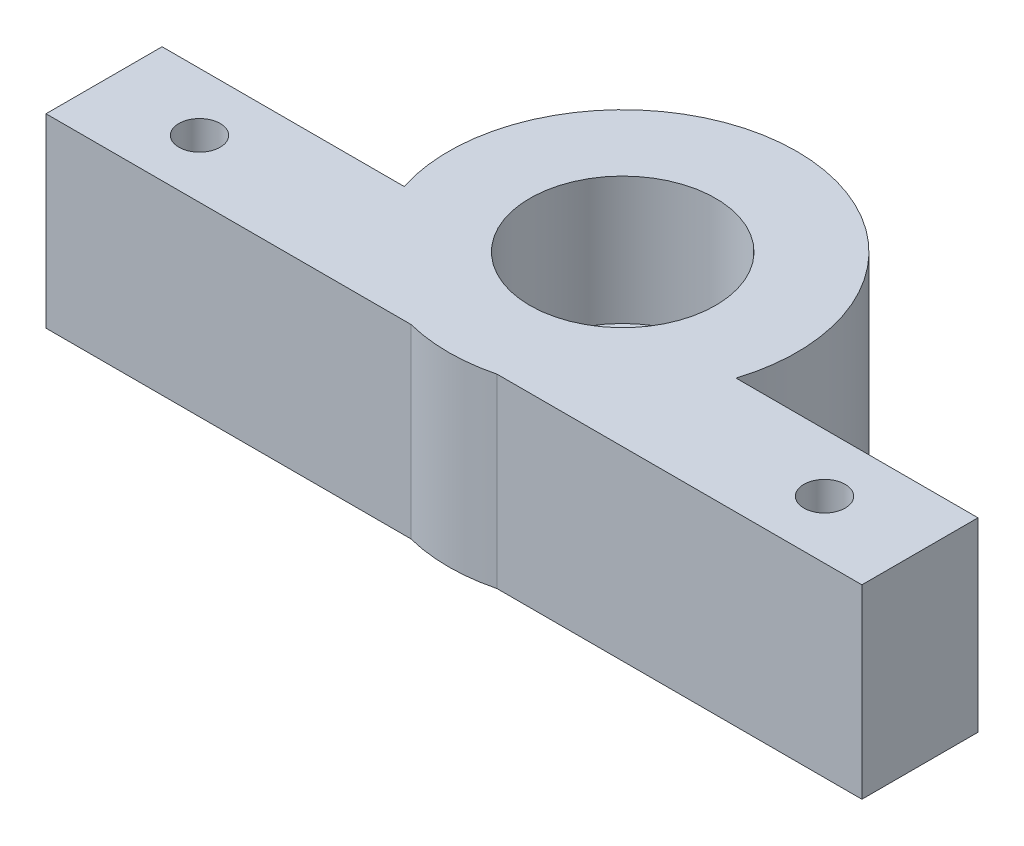
ISO-10303-21;
HEADER;
FILE_DESCRIPTION(('STEP AP214'),'2;1');
FILE_NAME('part.step','',(''),(''),'','','');
FILE_SCHEMA(('AUTOMOTIVE_DESIGN { 1 0 10303 214 1 1 1 1 }'));
ENDSEC;
DATA;
#1=APPLICATION_CONTEXT('core data for automotive mechanical design processes');
#2=APPLICATION_PROTOCOL_DEFINITION('international standard','automotive_design',2000,#1);
#3=PRODUCT_CONTEXT('',#1,'mechanical');
#4=PRODUCT('Part','Part','',(#3));
#5=PRODUCT_RELATED_PRODUCT_CATEGORY('part','',(#4));
#6=PRODUCT_DEFINITION_FORMATION('','',#4);
#7=PRODUCT_DEFINITION_CONTEXT('part definition',#1,'design');
#8=PRODUCT_DEFINITION('design','',#6,#7);
#9=PRODUCT_DEFINITION_SHAPE('','',#8);
#10=(LENGTH_UNIT() NAMED_UNIT(*) SI_UNIT(.MILLI.,.METRE.));
#11=(NAMED_UNIT(*) PLANE_ANGLE_UNIT() SI_UNIT($,.RADIAN.));
#12=(NAMED_UNIT(*) SI_UNIT($,.STERADIAN.) SOLID_ANGLE_UNIT());
#13=UNCERTAINTY_MEASURE_WITH_UNIT(LENGTH_MEASURE(1.E-05),#10,'distance_accuracy_value','');
#14=(GEOMETRIC_REPRESENTATION_CONTEXT(3) GLOBAL_UNCERTAINTY_ASSIGNED_CONTEXT((#13)) GLOBAL_UNIT_ASSIGNED_CONTEXT((#10,
#11,#12)) REPRESENTATION_CONTEXT('',''));
#15=CARTESIAN_POINT('',(0.,0.,0.));
#16=DIRECTION('',(0.,0.,1.));
#17=DIRECTION('',(1.,0.,0.));
#18=AXIS2_PLACEMENT_3D('',#15,#16,#17);
#19=CARTESIAN_POINT('',(0.,8.,0.));
#20=DIRECTION('',(0.,-1.,0.));
#21=DIRECTION('',(0.,0.,-1.));
#22=AXIS2_PLACEMENT_3D('',#19,#20,#21);
#23=CYLINDRICAL_SURFACE('',#22,1.875);
#24=CARTESIAN_POINT('',(0.,0.,0.));
#25=DIRECTION('',(0.,1.,0.));
#26=DIRECTION('',(0.,0.,1.));
#27=AXIS2_PLACEMENT_3D('',#24,#25,#26);
#28=CIRCLE('',#27,1.875);
#29=CARTESIAN_POINT('',(0.,0.,1.875));
#30=VERTEX_POINT('',#29);
#31=EDGE_CURVE('E138',#30,#30,#28,.T.);
#32=ORIENTED_EDGE('',*,*,#31,.F.);
#33=EDGE_LOOP('',(#32));
#34=FACE_BOUND('',#33,.T.);
#35=CARTESIAN_POINT('',(0.,2.5,0.));
#36=DIRECTION('',(0.,1.,0.));
#37=DIRECTION('',(0.,0.,1.));
#38=AXIS2_PLACEMENT_3D('',#35,#36,#37);
#39=CIRCLE('',#38,1.875);
#40=CARTESIAN_POINT('',(0.,2.5,1.875));
#41=VERTEX_POINT('',#40);
#42=EDGE_CURVE('E39',#41,#41,#39,.T.);
#43=ORIENTED_EDGE('',*,*,#42,.T.);
#44=EDGE_LOOP('',(#43));
#45=FACE_BOUND('',#44,.T.);
#46=ADVANCED_FACE('F35',(#34,#45),#23,.F.);
#47=CARTESIAN_POINT('',(0.,8.,0.));
#48=DIRECTION('',(0.,1.,0.));
#49=DIRECTION('',(0.,0.,1.));
#50=AXIS2_PLACEMENT_3D('',#47,#48,#49);
#51=PLANE('',#50);
#52=CARTESIAN_POINT('',(0.,8.,0.));
#53=DIRECTION('',(0.,1.,0.));
#54=DIRECTION('',(0.,0.,1.));
#55=AXIS2_PLACEMENT_3D('',#52,#53,#54);
#56=CIRCLE('',#55,4.);
#57=CARTESIAN_POINT('',(0.,8.,4.));
#58=VERTEX_POINT('',#57);
#59=EDGE_CURVE('E198',#58,#58,#56,.T.);
#60=ORIENTED_EDGE('',*,*,#59,.F.);
#61=EDGE_LOOP('',(#60));
#62=FACE_BOUND('',#61,.T.);
#63=CARTESIAN_POINT('',(-13.46,8.,4.76772943389164));
#64=DIRECTION('',(0.,1.,0.));
#65=DIRECTION('',(0.,0.,1.));
#66=AXIS2_PLACEMENT_3D('',#63,#64,#65);
#67=CIRCLE('',#66,0.889000000000002);
#68=CARTESIAN_POINT('',(-13.46,8.,5.65672943389165));
#69=VERTEX_POINT('',#68);
#70=EDGE_CURVE('E186',#69,#69,#67,.T.);
#71=ORIENTED_EDGE('',*,*,#70,.F.);
#72=EDGE_LOOP('',(#71));
#73=FACE_BOUND('',#72,.T.);
#74=CARTESIAN_POINT('',(0.,8.,0.));
#75=DIRECTION('',(0.,1.,0.));
#76=DIRECTION('',(0.,0.,1.));
#77=AXIS2_PLACEMENT_3D('',#74,#75,#76);
#78=CIRCLE('',#77,7.5);
#79=CARTESIAN_POINT('',(-1.85205531120024,8.,7.26772943389164));
#80=VERTEX_POINT('',#79);
#81=CARTESIAN_POINT('',(1.85205531120024,8.,7.26772943389164));
#82=VERTEX_POINT('',#81);
#83=EDGE_CURVE('E149',#80,#82,#78,.T.);
#84=ORIENTED_EDGE('',*,*,#83,.T.);
#85=DIRECTION('',(1.,0.,0.));
#86=VECTOR('',#85,1.);
#87=CARTESIAN_POINT('',(17.5696170458769,8.,7.26772943389164));
#88=LINE('',#87,#86);
#89=CARTESIAN_POINT('',(17.5696170458769,8.,7.26772943389164));
#90=VERTEX_POINT('',#89);
#91=EDGE_CURVE('E96',#82,#90,#88,.T.);
#92=ORIENTED_EDGE('',*,*,#91,.T.);
#93=DIRECTION('',(0.,0.,-1.));
#94=VECTOR('',#93,1.);
#95=CARTESIAN_POINT('',(17.5696170458769,8.,2.26772943389165));
#96=LINE('',#95,#94);
#97=CARTESIAN_POINT('',(17.5696170458769,8.,2.26772943389165));
#98=VERTEX_POINT('',#97);
#99=EDGE_CURVE('E165',#90,#98,#96,.T.);
#100=ORIENTED_EDGE('',*,*,#99,.T.);
#101=DIRECTION('',(-1.,0.,0.));
#102=VECTOR('',#101,1.);
#103=CARTESIAN_POINT('',(7.14894420279397,8.,2.26772943389165));
#104=LINE('',#103,#102);
#105=CARTESIAN_POINT('',(7.14894420279397,8.,2.26772943389165));
#106=VERTEX_POINT('',#105);
#107=EDGE_CURVE('E178',#98,#106,#104,.T.);
#108=ORIENTED_EDGE('',*,*,#107,.T.);
#109=CARTESIAN_POINT('',(0.,8.,0.));
#110=DIRECTION('',(0.,1.,0.));
#111=DIRECTION('',(0.,0.,1.));
#112=AXIS2_PLACEMENT_3D('',#109,#110,#111);
#113=CIRCLE('',#112,7.5);
#114=CARTESIAN_POINT('',(-7.14894420279397,8.,2.26772943389165));
#115=VERTEX_POINT('',#114);
#116=EDGE_CURVE('E116',#106,#115,#113,.T.);
#117=ORIENTED_EDGE('',*,*,#116,.T.);
#118=DIRECTION('',(-1.,0.,0.));
#119=VECTOR('',#118,1.);
#120=CARTESIAN_POINT('',(-7.14894420279397,8.,2.26772943389165));
#121=LINE('',#120,#119);
#122=CARTESIAN_POINT('',(-17.572518577854,8.,2.26772943389165));
#123=VERTEX_POINT('',#122);
#124=EDGE_CURVE('E109',#115,#123,#121,.T.);
#125=ORIENTED_EDGE('',*,*,#124,.T.);
#126=DIRECTION('',(0.,0.,1.));
#127=VECTOR('',#126,1.);
#128=CARTESIAN_POINT('',(-17.572518577854,8.,2.26772943389165));
#129=LINE('',#128,#127);
#130=CARTESIAN_POINT('',(-17.572518577854,8.,7.26772943389165));
#131=VERTEX_POINT('',#130);
#132=EDGE_CURVE('E114',#123,#131,#129,.T.);
#133=ORIENTED_EDGE('',*,*,#132,.T.);
#134=DIRECTION('',(1.,0.,0.));
#135=VECTOR('',#134,1.);
#136=CARTESIAN_POINT('',(-17.572518577854,8.,7.26772943389165));
#137=LINE('',#136,#135);
#138=EDGE_CURVE('E53',#131,#80,#137,.T.);
#139=ORIENTED_EDGE('',*,*,#138,.T.);
#140=EDGE_LOOP('',(#84,#92,#100,#108,#117,#125,#133,#139));
#141=FACE_BOUND('',#140,.T.);
#142=CARTESIAN_POINT('',(13.46,8.,4.76772943389165));
#143=DIRECTION('',(0.,1.,0.));
#144=DIRECTION('',(0.,0.,1.));
#145=AXIS2_PLACEMENT_3D('',#142,#143,#144);
#146=CIRCLE('',#145,0.889000000000002);
#147=CARTESIAN_POINT('',(13.46,8.,5.65672943389165));
#148=VERTEX_POINT('',#147);
#149=EDGE_CURVE('E190',#148,#148,#146,.T.);
#150=ORIENTED_EDGE('',*,*,#149,.F.);
#151=EDGE_LOOP('',(#150));
#152=FACE_BOUND('',#151,.T.);
#153=ADVANCED_FACE('F111',(#62,#73,#141,#152),#51,.T.);
#154=CARTESIAN_POINT('',(0.,0.,0.));
#155=DIRECTION('',(0.,1.,0.));
#156=DIRECTION('',(0.,0.,1.));
#157=AXIS2_PLACEMENT_3D('',#154,#155,#156);
#158=PLANE('',#157);
#159=CARTESIAN_POINT('',(-13.46,0.,4.76772943389164));
#160=DIRECTION('',(0.,1.,0.));
#161=DIRECTION('',(0.,0.,1.));
#162=AXIS2_PLACEMENT_3D('',#159,#160,#161);
#163=CIRCLE('',#162,0.889000000000002);
#164=CARTESIAN_POINT('',(-13.46,0.,5.65672943389165));
#165=VERTEX_POINT('',#164);
#166=EDGE_CURVE('E187',#165,#165,#163,.T.);
#167=ORIENTED_EDGE('',*,*,#166,.T.);
#168=EDGE_LOOP('',(#167));
#169=FACE_BOUND('',#168,.T.);
#170=CARTESIAN_POINT('',(0.,0.,0.));
#171=DIRECTION('',(0.,1.,0.));
#172=DIRECTION('',(0.,0.,1.));
#173=AXIS2_PLACEMENT_3D('',#170,#171,#172);
#174=CIRCLE('',#173,7.5);
#175=CARTESIAN_POINT('',(-1.85205531120024,0.,7.26772943389164));
#176=VERTEX_POINT('',#175);
#177=CARTESIAN_POINT('',(1.85205531120024,0.,7.26772943389164));
#178=VERTEX_POINT('',#177);
#179=EDGE_CURVE('E134',#176,#178,#174,.T.);
#180=ORIENTED_EDGE('',*,*,#179,.F.);
#181=DIRECTION('',(1.,0.,0.));
#182=VECTOR('',#181,1.);
#183=CARTESIAN_POINT('',(-17.572518577854,0.,7.26772943389165));
#184=LINE('',#183,#182);
#185=CARTESIAN_POINT('',(-17.572518577854,0.,7.26772943389165));
#186=VERTEX_POINT('',#185);
#187=EDGE_CURVE('E88',#186,#176,#184,.T.);
#188=ORIENTED_EDGE('',*,*,#187,.F.);
#189=DIRECTION('',(0.,0.,1.));
#190=VECTOR('',#189,1.);
#191=CARTESIAN_POINT('',(-17.572518577854,0.,2.26772943389165));
#192=LINE('',#191,#190);
#193=CARTESIAN_POINT('',(-17.572518577854,0.,2.26772943389165));
#194=VERTEX_POINT('',#193);
#195=EDGE_CURVE('E82',#194,#186,#192,.T.);
#196=ORIENTED_EDGE('',*,*,#195,.F.);
#197=DIRECTION('',(-1.,0.,0.));
#198=VECTOR('',#197,1.);
#199=CARTESIAN_POINT('',(-7.14894420279397,0.,2.26772943389165));
#200=LINE('',#199,#198);
#201=CARTESIAN_POINT('',(-7.14894420279397,0.,2.26772943389165));
#202=VERTEX_POINT('',#201);
#203=EDGE_CURVE('E124',#202,#194,#200,.T.);
#204=ORIENTED_EDGE('',*,*,#203,.F.);
#205=CARTESIAN_POINT('',(0.,0.,0.));
#206=DIRECTION('',(0.,1.,0.));
#207=DIRECTION('',(0.,0.,1.));
#208=AXIS2_PLACEMENT_3D('',#205,#206,#207);
#209=CIRCLE('',#208,7.5);
#210=CARTESIAN_POINT('',(7.14894420279397,0.,2.26772943389165));
#211=VERTEX_POINT('',#210);
#212=EDGE_CURVE('E144',#211,#202,#209,.T.);
#213=ORIENTED_EDGE('',*,*,#212,.F.);
#214=DIRECTION('',(-1.,0.,0.));
#215=VECTOR('',#214,1.);
#216=CARTESIAN_POINT('',(7.14894420279397,0.,2.26772943389165));
#217=LINE('',#216,#215);
#218=CARTESIAN_POINT('',(17.5696170458769,0.,2.26772943389165));
#219=VERTEX_POINT('',#218);
#220=EDGE_CURVE('E142',#219,#211,#217,.T.);
#221=ORIENTED_EDGE('',*,*,#220,.F.);
#222=DIRECTION('',(0.,0.,-1.));
#223=VECTOR('',#222,1.);
#224=CARTESIAN_POINT('',(17.5696170458769,0.,2.26772943389165));
#225=LINE('',#224,#223);
#226=CARTESIAN_POINT('',(17.5696170458769,0.,7.26772943389164));
#227=VERTEX_POINT('',#226);
#228=EDGE_CURVE('E140',#227,#219,#225,.T.);
#229=ORIENTED_EDGE('',*,*,#228,.F.);
#230=DIRECTION('',(1.,0.,0.));
#231=VECTOR('',#230,1.);
#232=CARTESIAN_POINT('',(17.5696170458769,0.,7.26772943389164));
#233=LINE('',#232,#231);
#234=EDGE_CURVE('E137',#178,#227,#233,.T.);
#235=ORIENTED_EDGE('',*,*,#234,.F.);
#236=EDGE_LOOP('',(#180,#188,#196,#204,#213,#221,#229,#235));
#237=FACE_BOUND('',#236,.T.);
#238=ORIENTED_EDGE('',*,*,#31,.T.);
#239=EDGE_LOOP('',(#238));
#240=FACE_BOUND('',#239,.T.);
#241=CARTESIAN_POINT('',(13.46,0.,4.76772943389165));
#242=DIRECTION('',(0.,1.,0.));
#243=DIRECTION('',(0.,0.,1.));
#244=AXIS2_PLACEMENT_3D('',#241,#242,#243);
#245=CIRCLE('',#244,0.889000000000002);
#246=CARTESIAN_POINT('',(13.46,0.,5.65672943389165));
#247=VERTEX_POINT('',#246);
#248=EDGE_CURVE('E193',#247,#247,#245,.T.);
#249=ORIENTED_EDGE('',*,*,#248,.T.);
#250=EDGE_LOOP('',(#249));
#251=FACE_BOUND('',#250,.T.);
#252=ADVANCED_FACE('F169',(#169,#237,#240,#251),#158,.F.);
#253=CARTESIAN_POINT('',(0.,8.,0.));
#254=DIRECTION('',(0.,-1.,0.));
#255=DIRECTION('',(0.,0.,-1.));
#256=AXIS2_PLACEMENT_3D('',#253,#254,#255);
#257=CYLINDRICAL_SURFACE('',#256,7.5);
#258=ORIENTED_EDGE('',*,*,#179,.T.);
#259=DIRECTION('',(0.,-1.,0.));
#260=VECTOR('',#259,1.);
#261=CARTESIAN_POINT('',(1.85205531120024,8.,7.26772943389164));
#262=LINE('',#261,#260);
#263=EDGE_CURVE('E11',#82,#178,#262,.T.);
#264=ORIENTED_EDGE('',*,*,#263,.F.);
#265=ORIENTED_EDGE('',*,*,#83,.F.);
#266=DIRECTION('',(0.,-1.,0.));
#267=VECTOR('',#266,1.);
#268=CARTESIAN_POINT('',(-1.85205531120024,8.,7.26772943389164));
#269=LINE('',#268,#267);
#270=EDGE_CURVE('E130',#80,#176,#269,.T.);
#271=ORIENTED_EDGE('',*,*,#270,.T.);
#272=EDGE_LOOP('',(#258,#264,#265,#271));
#273=FACE_BOUND('',#272,.T.);
#274=ADVANCED_FACE('F37',(#273),#257,.T.);
#275=CARTESIAN_POINT('',(17.5696170458769,8.,7.26772943389164));
#276=DIRECTION('',(0.,0.,-1.));
#277=DIRECTION('',(-1.,0.,0.));
#278=AXIS2_PLACEMENT_3D('',#275,#276,#277);
#279=PLANE('',#278);
#280=ORIENTED_EDGE('',*,*,#234,.T.);
#281=DIRECTION('',(0.,-1.,0.));
#282=VECTOR('',#281,1.);
#283=CARTESIAN_POINT('',(17.5696170458769,8.,7.26772943389164));
#284=LINE('',#283,#282);
#285=EDGE_CURVE('E45',#90,#227,#284,.T.);
#286=ORIENTED_EDGE('',*,*,#285,.F.);
#287=ORIENTED_EDGE('',*,*,#91,.F.);
#288=ORIENTED_EDGE('',*,*,#263,.T.);
#289=EDGE_LOOP('',(#280,#286,#287,#288));
#290=FACE_BOUND('',#289,.T.);
#291=ADVANCED_FACE('F247',(#290),#279,.F.);
#292=CARTESIAN_POINT('',(17.5696170458769,8.,2.26772943389165));
#293=DIRECTION('',(-1.,0.,0.));
#294=DIRECTION('',(0.,0.,1.));
#295=AXIS2_PLACEMENT_3D('',#292,#293,#294);
#296=PLANE('',#295);
#297=ORIENTED_EDGE('',*,*,#228,.T.);
#298=DIRECTION('',(0.,-1.,0.));
#299=VECTOR('',#298,1.);
#300=CARTESIAN_POINT('',(17.5696170458769,8.,2.26772943389165));
#301=LINE('',#300,#299);
#302=EDGE_CURVE('E156',#98,#219,#301,.T.);
#303=ORIENTED_EDGE('',*,*,#302,.F.);
#304=ORIENTED_EDGE('',*,*,#99,.F.);
#305=ORIENTED_EDGE('',*,*,#285,.T.);
#306=EDGE_LOOP('',(#297,#303,#304,#305));
#307=FACE_BOUND('',#306,.T.);
#308=ADVANCED_FACE('F163',(#307),#296,.F.);
#309=CARTESIAN_POINT('',(7.14894420279397,8.,2.26772943389165));
#310=DIRECTION('',(0.,0.,1.));
#311=DIRECTION('',(1.,0.,0.));
#312=AXIS2_PLACEMENT_3D('',#309,#310,#311);
#313=PLANE('',#312);
#314=ORIENTED_EDGE('',*,*,#220,.T.);
#315=DIRECTION('',(0.,-1.,0.));
#316=VECTOR('',#315,1.);
#317=CARTESIAN_POINT('',(7.14894420279397,8.,2.26772943389165));
#318=LINE('',#317,#316);
#319=EDGE_CURVE('E153',#106,#211,#318,.T.);
#320=ORIENTED_EDGE('',*,*,#319,.F.);
#321=ORIENTED_EDGE('',*,*,#107,.F.);
#322=ORIENTED_EDGE('',*,*,#302,.T.);
#323=EDGE_LOOP('',(#314,#320,#321,#322));
#324=FACE_BOUND('',#323,.T.);
#325=ADVANCED_FACE('F174',(#324),#313,.F.);
#326=CARTESIAN_POINT('',(0.,8.,0.));
#327=DIRECTION('',(0.,-1.,0.));
#328=DIRECTION('',(0.,0.,-1.));
#329=AXIS2_PLACEMENT_3D('',#326,#327,#328);
#330=CYLINDRICAL_SURFACE('',#329,7.5);
#331=ORIENTED_EDGE('',*,*,#212,.T.);
#332=DIRECTION('',(0.,-1.,0.));
#333=VECTOR('',#332,1.);
#334=CARTESIAN_POINT('',(-7.14894420279397,8.,2.26772943389165));
#335=LINE('',#334,#333);
#336=EDGE_CURVE('E125',#115,#202,#335,.T.);
#337=ORIENTED_EDGE('',*,*,#336,.F.);
#338=ORIENTED_EDGE('',*,*,#116,.F.);
#339=ORIENTED_EDGE('',*,*,#319,.T.);
#340=EDGE_LOOP('',(#331,#337,#338,#339));
#341=FACE_BOUND('',#340,.T.);
#342=ADVANCED_FACE('F177',(#341),#330,.T.);
#343=CARTESIAN_POINT('',(-7.14894420279397,8.,2.26772943389165));
#344=DIRECTION('',(0.,0.,1.));
#345=DIRECTION('',(1.,0.,0.));
#346=AXIS2_PLACEMENT_3D('',#343,#344,#345);
#347=PLANE('',#346);
#348=ORIENTED_EDGE('',*,*,#203,.T.);
#349=DIRECTION('',(0.,-1.,0.));
#350=VECTOR('',#349,1.);
#351=CARTESIAN_POINT('',(-17.572518577854,8.,2.26772943389165));
#352=LINE('',#351,#350);
#353=EDGE_CURVE('E121',#123,#194,#352,.T.);
#354=ORIENTED_EDGE('',*,*,#353,.F.);
#355=ORIENTED_EDGE('',*,*,#124,.F.);
#356=ORIENTED_EDGE('',*,*,#336,.T.);
#357=EDGE_LOOP('',(#348,#354,#355,#356));
#358=FACE_BOUND('',#357,.T.);
#359=ADVANCED_FACE('F122',(#358),#347,.F.);
#360=CARTESIAN_POINT('',(-17.572518577854,8.,2.26772943389165));
#361=DIRECTION('',(1.,0.,0.));
#362=DIRECTION('',(0.,0.,-1.));
#363=AXIS2_PLACEMENT_3D('',#360,#361,#362);
#364=PLANE('',#363);
#365=ORIENTED_EDGE('',*,*,#195,.T.);
#366=DIRECTION('',(0.,-1.,0.));
#367=VECTOR('',#366,1.);
#368=CARTESIAN_POINT('',(-17.572518577854,8.,7.26772943389165));
#369=LINE('',#368,#367);
#370=EDGE_CURVE('E126',#131,#186,#369,.T.);
#371=ORIENTED_EDGE('',*,*,#370,.F.);
#372=ORIENTED_EDGE('',*,*,#132,.F.);
#373=ORIENTED_EDGE('',*,*,#353,.T.);
#374=EDGE_LOOP('',(#365,#371,#372,#373));
#375=FACE_BOUND('',#374,.T.);
#376=ADVANCED_FACE('F128',(#375),#364,.F.);
#377=CARTESIAN_POINT('',(-17.572518577854,8.,7.26772943389165));
#378=DIRECTION('',(0.,0.,-1.));
#379=DIRECTION('',(-1.,0.,0.));
#380=AXIS2_PLACEMENT_3D('',#377,#378,#379);
#381=PLANE('',#380);
#382=ORIENTED_EDGE('',*,*,#187,.T.);
#383=ORIENTED_EDGE('',*,*,#270,.F.);
#384=ORIENTED_EDGE('',*,*,#138,.F.);
#385=ORIENTED_EDGE('',*,*,#370,.T.);
#386=EDGE_LOOP('',(#382,#383,#384,#385));
#387=FACE_BOUND('',#386,.T.);
#388=ADVANCED_FACE('F235',(#387),#381,.F.);
#389=CARTESIAN_POINT('',(-13.46,8.,4.76772943389164));
#390=DIRECTION('',(0.,-1.,0.));
#391=DIRECTION('',(0.,0.,-1.));
#392=AXIS2_PLACEMENT_3D('',#389,#390,#391);
#393=CYLINDRICAL_SURFACE('',#392,0.889000000000002);
#394=ORIENTED_EDGE('',*,*,#70,.T.);
#395=EDGE_LOOP('',(#394));
#396=FACE_BOUND('',#395,.T.);
#397=ORIENTED_EDGE('',*,*,#166,.F.);
#398=EDGE_LOOP('',(#397));
#399=FACE_BOUND('',#398,.T.);
#400=ADVANCED_FACE('F229',(#396,#399),#393,.F.);
#401=CARTESIAN_POINT('',(13.46,8.,4.76772943389165));
#402=DIRECTION('',(0.,-1.,0.));
#403=DIRECTION('',(0.,0.,-1.));
#404=AXIS2_PLACEMENT_3D('',#401,#402,#403);
#405=CYLINDRICAL_SURFACE('',#404,0.889000000000002);
#406=ORIENTED_EDGE('',*,*,#149,.T.);
#407=EDGE_LOOP('',(#406));
#408=FACE_BOUND('',#407,.T.);
#409=ORIENTED_EDGE('',*,*,#248,.F.);
#410=EDGE_LOOP('',(#409));
#411=FACE_BOUND('',#410,.T.);
#412=ADVANCED_FACE('F216',(#408,#411),#405,.F.);
#413=CARTESIAN_POINT('',(0.,2.5,0.));
#414=DIRECTION('',(0.,1.,0.));
#415=DIRECTION('',(0.,0.,1.));
#416=AXIS2_PLACEMENT_3D('',#413,#414,#415);
#417=CYLINDRICAL_SURFACE('',#416,4.);
#418=CARTESIAN_POINT('',(0.,2.5,0.));
#419=DIRECTION('',(0.,1.,0.));
#420=DIRECTION('',(0.,0.,1.));
#421=AXIS2_PLACEMENT_3D('',#418,#419,#420);
#422=CIRCLE('',#421,4.);
#423=CARTESIAN_POINT('',(0.,2.5,4.));
#424=VERTEX_POINT('',#423);
#425=EDGE_CURVE('E201',#424,#424,#422,.T.);
#426=ORIENTED_EDGE('',*,*,#425,.F.);
#427=EDGE_LOOP('',(#426));
#428=FACE_BOUND('',#427,.T.);
#429=ORIENTED_EDGE('',*,*,#59,.T.);
#430=EDGE_LOOP('',(#429));
#431=FACE_BOUND('',#430,.T.);
#432=ADVANCED_FACE('F211',(#428,#431),#417,.F.);
#433=CARTESIAN_POINT('',(0.,2.5,0.));
#434=DIRECTION('',(0.,1.,0.));
#435=DIRECTION('',(0.,0.,1.));
#436=AXIS2_PLACEMENT_3D('',#433,#434,#435);
#437=PLANE('',#436);
#438=ORIENTED_EDGE('',*,*,#42,.F.);
#439=EDGE_LOOP('',(#438));
#440=FACE_BOUND('',#439,.T.);
#441=ORIENTED_EDGE('',*,*,#425,.T.);
#442=EDGE_LOOP('',(#441));
#443=FACE_BOUND('',#442,.T.);
#444=ADVANCED_FACE('F209',(#440,#443),#437,.T.);
#445=CLOSED_SHELL('',(#46,#153,#252,#274,#291,#308,#325,#342,#359,#376,#388,#400,#412,#432,#444));
#446=MANIFOLD_SOLID_BREP('B2',#445);
#447=ADVANCED_BREP_SHAPE_REPRESENTATION('',(#18,#446),#14);
#448=SHAPE_DEFINITION_REPRESENTATION(#9,#447);
ENDSEC;
END-ISO-10303-21;
